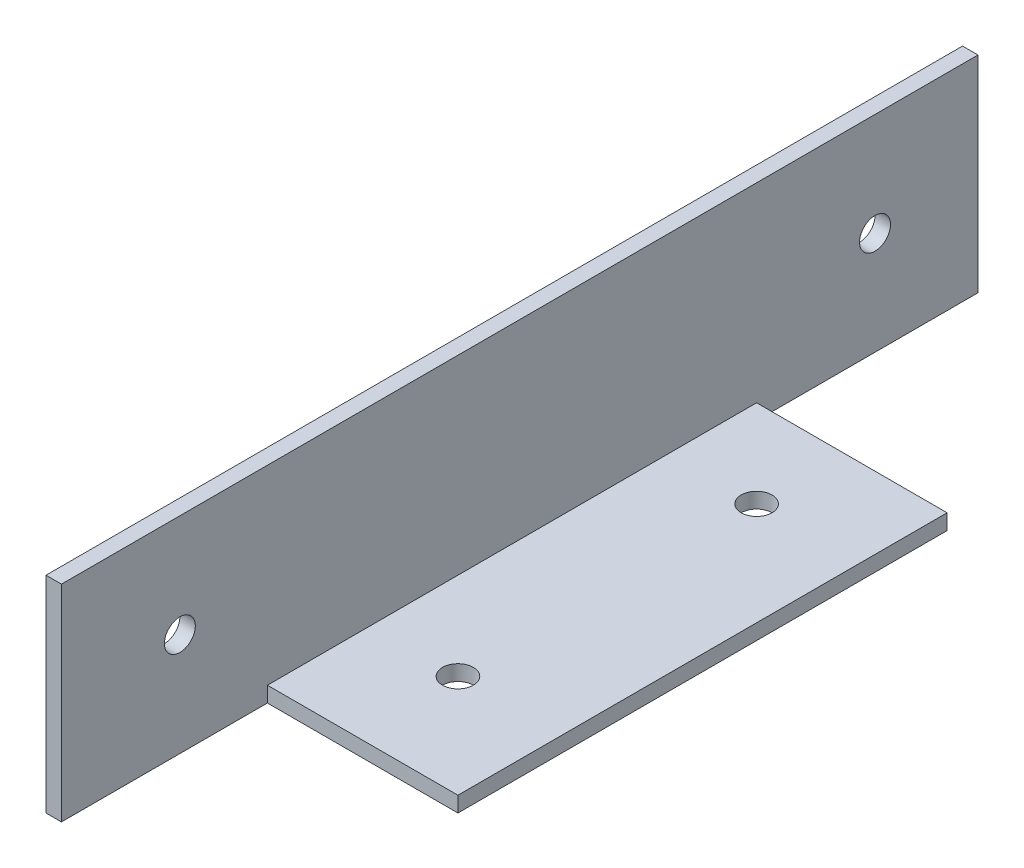
ISO-10303-21;
HEADER;
FILE_DESCRIPTION(('STEP AP214'),'2;1');
FILE_NAME('part.step','',(''),(''),'','','');
FILE_SCHEMA(('AUTOMOTIVE_DESIGN { 1 0 10303 214 1 1 1 1 }'));
ENDSEC;
DATA;
#1=APPLICATION_CONTEXT('core data for automotive mechanical design processes');
#2=APPLICATION_PROTOCOL_DEFINITION('international standard','automotive_design',2000,#1);
#3=PRODUCT_CONTEXT('',#1,'mechanical');
#4=PRODUCT('Part','Part','',(#3));
#5=PRODUCT_RELATED_PRODUCT_CATEGORY('part','',(#4));
#6=PRODUCT_DEFINITION_FORMATION('','',#4);
#7=PRODUCT_DEFINITION_CONTEXT('part definition',#1,'design');
#8=PRODUCT_DEFINITION('design','',#6,#7);
#9=PRODUCT_DEFINITION_SHAPE('','',#8);
#10=(LENGTH_UNIT() NAMED_UNIT(*) SI_UNIT(.MILLI.,.METRE.));
#11=(NAMED_UNIT(*) PLANE_ANGLE_UNIT() SI_UNIT($,.RADIAN.));
#12=(NAMED_UNIT(*) SI_UNIT($,.STERADIAN.) SOLID_ANGLE_UNIT());
#13=UNCERTAINTY_MEASURE_WITH_UNIT(LENGTH_MEASURE(1.E-05),#10,'distance_accuracy_value','');
#14=(GEOMETRIC_REPRESENTATION_CONTEXT(3) GLOBAL_UNCERTAINTY_ASSIGNED_CONTEXT((#13)) GLOBAL_UNIT_ASSIGNED_CONTEXT((#10,
#11,#12)) REPRESENTATION_CONTEXT('',''));
#15=CARTESIAN_POINT('',(0.,0.,0.));
#16=DIRECTION('',(0.,0.,1.));
#17=DIRECTION('',(1.,0.,0.));
#18=AXIS2_PLACEMENT_3D('',#15,#16,#17);
#19=CARTESIAN_POINT('',(-23.4313705903621,6.59147368421053,89.));
#20=DIRECTION('',(0.,-1.,0.));
#21=DIRECTION('',(0.,0.,-1.));
#22=AXIS2_PLACEMENT_3D('',#19,#20,#21);
#23=PLANE('',#22);
#24=DIRECTION('',(-1.,0.,0.));
#25=VECTOR('',#24,1.);
#26=CARTESIAN_POINT('',(-23.4313705903621,6.59147368421053,0.));
#27=LINE('',#26,#25);
#28=CARTESIAN_POINT('',(-23.4313705903621,6.59147368421053,0.));
#29=VERTEX_POINT('',#28);
#30=CARTESIAN_POINT('',(-24.9313705903621,6.59147368421053,0.));
#31=VERTEX_POINT('',#30);
#32=EDGE_CURVE('E146',#29,#31,#27,.T.);
#33=ORIENTED_EDGE('',*,*,#32,.T.);
#34=DIRECTION('',(0.,0.,-1.));
#35=VECTOR('',#34,1.);
#36=CARTESIAN_POINT('',(-24.9313705903621,6.59147368421053,89.));
#37=LINE('',#36,#35);
#38=CARTESIAN_POINT('',(-24.9313705903621,6.59147368421053,89.));
#39=VERTEX_POINT('',#38);
#40=EDGE_CURVE('E11',#39,#31,#37,.T.);
#41=ORIENTED_EDGE('',*,*,#40,.F.);
#42=DIRECTION('',(-1.,0.,0.));
#43=VECTOR('',#42,1.);
#44=CARTESIAN_POINT('',(-23.4313705903621,6.59147368421053,89.));
#45=LINE('',#44,#43);
#46=CARTESIAN_POINT('',(-23.4313705903621,6.59147368421053,89.));
#47=VERTEX_POINT('',#46);
#48=EDGE_CURVE('E145',#47,#39,#45,.T.);
#49=ORIENTED_EDGE('',*,*,#48,.F.);
#50=DIRECTION('',(0.,0.,-1.));
#51=VECTOR('',#50,1.);
#52=CARTESIAN_POINT('',(-23.4313705903621,6.59147368421053,89.));
#53=LINE('',#52,#51);
#54=EDGE_CURVE('E126',#47,#29,#53,.T.);
#55=ORIENTED_EDGE('',*,*,#54,.T.);
#56=EDGE_LOOP('',(#33,#41,#49,#55));
#57=FACE_BOUND('',#56,.T.);
#58=ADVANCED_FACE('F31',(#57),#23,.F.);
#59=CARTESIAN_POINT('',(-24.9313705903621,6.59147368421053,89.));
#60=DIRECTION('',(1.,0.,0.));
#61=DIRECTION('',(0.,0.,-1.));
#62=AXIS2_PLACEMENT_3D('',#59,#60,#61);
#63=PLANE('',#62);
#64=CARTESIAN_POINT('',(-24.9313705903621,-3.40852631578947,9.99999999999999));
#65=DIRECTION('',(1.,0.,0.));
#66=DIRECTION('',(0.,0.,-1.));
#67=AXIS2_PLACEMENT_3D('',#64,#65,#66);
#68=CIRCLE('',#67,1.5);
#69=CARTESIAN_POINT('',(-24.9313705903621,-3.40852631578947,8.5));
#70=VERTEX_POINT('',#69);
#71=EDGE_CURVE('E186',#70,#70,#68,.T.);
#72=ORIENTED_EDGE('',*,*,#71,.T.);
#73=EDGE_LOOP('',(#72));
#74=FACE_BOUND('',#73,.T.);
#75=CARTESIAN_POINT('',(-24.9313705903621,-3.40852631578947,77.5));
#76=DIRECTION('',(1.,0.,0.));
#77=DIRECTION('',(0.,0.,-1.));
#78=AXIS2_PLACEMENT_3D('',#75,#76,#77);
#79=CIRCLE('',#78,1.5);
#80=CARTESIAN_POINT('',(-24.9313705903621,-3.40852631578947,76.));
#81=VERTEX_POINT('',#80);
#82=EDGE_CURVE('E120',#81,#81,#79,.T.);
#83=ORIENTED_EDGE('',*,*,#82,.T.);
#84=EDGE_LOOP('',(#83));
#85=FACE_BOUND('',#84,.T.);
#86=DIRECTION('',(0.,-1.,0.));
#87=VECTOR('',#86,1.);
#88=CARTESIAN_POINT('',(-24.9313705903621,6.59147368421053,0.));
#89=LINE('',#88,#87);
#90=CARTESIAN_POINT('',(-24.9313705903621,-13.4085263157895,0.));
#91=VERTEX_POINT('',#90);
#92=EDGE_CURVE('E143',#31,#91,#89,.T.);
#93=ORIENTED_EDGE('',*,*,#92,.T.);
#94=DIRECTION('',(0.,0.,-1.));
#95=VECTOR('',#94,1.);
#96=CARTESIAN_POINT('',(-24.9313705903621,-13.4085263157895,89.));
#97=LINE('',#96,#95);
#98=CARTESIAN_POINT('',(-24.9313705903621,-13.4085263157895,89.));
#99=VERTEX_POINT('',#98);
#100=EDGE_CURVE('E38',#99,#91,#97,.T.);
#101=ORIENTED_EDGE('',*,*,#100,.F.);
#102=DIRECTION('',(0.,-1.,0.));
#103=VECTOR('',#102,1.);
#104=CARTESIAN_POINT('',(-24.9313705903621,6.59147368421053,89.));
#105=LINE('',#104,#103);
#106=EDGE_CURVE('E73',#39,#99,#105,.T.);
#107=ORIENTED_EDGE('',*,*,#106,.F.);
#108=ORIENTED_EDGE('',*,*,#40,.T.);
#109=EDGE_LOOP('',(#93,#101,#107,#108));
#110=FACE_BOUND('',#109,.T.);
#111=ADVANCED_FACE('F208',(#74,#85,#110),#63,.F.);
#112=CARTESIAN_POINT('',(-24.9313705903621,-13.4085263157895,89.));
#113=DIRECTION('',(0.,1.,0.));
#114=DIRECTION('',(0.,0.,1.));
#115=AXIS2_PLACEMENT_3D('',#112,#113,#114);
#116=PLANE('',#115);
#117=CARTESIAN_POINT('',(-14.9313705903621,-13.4085263157895,30.));
#118=DIRECTION('',(0.,1.,0.));
#119=DIRECTION('',(0.,0.,1.));
#120=AXIS2_PLACEMENT_3D('',#117,#118,#119);
#121=CIRCLE('',#120,1.5);
#122=CARTESIAN_POINT('',(-14.9313705903621,-13.4085263157895,31.5));
#123=VERTEX_POINT('',#122);
#124=EDGE_CURVE('E161',#123,#123,#121,.T.);
#125=ORIENTED_EDGE('',*,*,#124,.T.);
#126=EDGE_LOOP('',(#125));
#127=FACE_BOUND('',#126,.T.);
#128=CARTESIAN_POINT('',(-14.9313705903621,-13.4085263157895,59.));
#129=DIRECTION('',(0.,1.,0.));
#130=DIRECTION('',(0.,0.,1.));
#131=AXIS2_PLACEMENT_3D('',#128,#129,#130);
#132=CIRCLE('',#131,1.5);
#133=CARTESIAN_POINT('',(-14.9313705903621,-13.4085263157895,60.5));
#134=VERTEX_POINT('',#133);
#135=EDGE_CURVE('E151',#134,#134,#132,.T.);
#136=ORIENTED_EDGE('',*,*,#135,.T.);
#137=EDGE_LOOP('',(#136));
#138=FACE_BOUND('',#137,.T.);
#139=DIRECTION('',(0.,0.,1.));
#140=VECTOR('',#139,1.);
#141=CARTESIAN_POINT('',(-23.4313705903621,-13.4085263157895,89.));
#142=LINE('',#141,#140);
#143=CARTESIAN_POINT('',(-23.4313705903621,-13.4085263157895,0.));
#144=VERTEX_POINT('',#143);
#145=CARTESIAN_POINT('',(-23.4313705903621,-13.4085263157895,21.5));
#146=VERTEX_POINT('',#145);
#147=EDGE_CURVE('E178',#144,#146,#142,.T.);
#148=ORIENTED_EDGE('',*,*,#147,.T.);
#149=DIRECTION('',(1.,0.,0.));
#150=VECTOR('',#149,1.);
#151=CARTESIAN_POINT('',(-24.9313705903621,-13.4085263157895,21.5));
#152=LINE('',#151,#150);
#153=CARTESIAN_POINT('',(-4.93137059036207,-13.4085263157895,21.5));
#154=VERTEX_POINT('',#153);
#155=EDGE_CURVE('E107',#146,#154,#152,.T.);
#156=ORIENTED_EDGE('',*,*,#155,.T.);
#157=DIRECTION('',(0.,0.,-1.));
#158=VECTOR('',#157,1.);
#159=CARTESIAN_POINT('',(-4.93137059036207,-13.4085263157895,89.));
#160=LINE('',#159,#158);
#161=CARTESIAN_POINT('',(-4.93137059036207,-13.4085263157895,69.));
#162=VERTEX_POINT('',#161);
#163=EDGE_CURVE('E128',#162,#154,#160,.T.);
#164=ORIENTED_EDGE('',*,*,#163,.F.);
#165=DIRECTION('',(-1.,0.,0.));
#166=VECTOR('',#165,1.);
#167=CARTESIAN_POINT('',(-24.9313705903621,-13.4085263157895,69.));
#168=LINE('',#167,#166);
#169=CARTESIAN_POINT('',(-23.4313705903621,-13.4085263157895,69.));
#170=VERTEX_POINT('',#169);
#171=EDGE_CURVE('E167',#162,#170,#168,.T.);
#172=ORIENTED_EDGE('',*,*,#171,.T.);
#173=DIRECTION('',(0.,0.,1.));
#174=VECTOR('',#173,1.);
#175=CARTESIAN_POINT('',(-23.4313705903621,-13.4085263157895,89.));
#176=LINE('',#175,#174);
#177=CARTESIAN_POINT('',(-23.4313705903621,-13.4085263157895,89.));
#178=VERTEX_POINT('',#177);
#179=EDGE_CURVE('E170',#170,#178,#176,.T.);
#180=ORIENTED_EDGE('',*,*,#179,.T.);
#181=DIRECTION('',(1.,0.,0.));
#182=VECTOR('',#181,1.);
#183=CARTESIAN_POINT('',(-24.9313705903621,-13.4085263157895,89.));
#184=LINE('',#183,#182);
#185=EDGE_CURVE('E141',#99,#178,#184,.T.);
#186=ORIENTED_EDGE('',*,*,#185,.F.);
#187=ORIENTED_EDGE('',*,*,#100,.T.);
#188=DIRECTION('',(1.,0.,0.));
#189=VECTOR('',#188,1.);
#190=CARTESIAN_POINT('',(-24.9313705903621,-13.4085263157895,0.));
#191=LINE('',#190,#189);
#192=EDGE_CURVE('E139',#91,#144,#191,.T.);
#193=ORIENTED_EDGE('',*,*,#192,.T.);
#194=EDGE_LOOP('',(#148,#156,#164,#172,#180,#186,#187,#193));
#195=FACE_BOUND('',#194,.T.);
#196=ADVANCED_FACE('F138',(#127,#138,#195),#116,.F.);
#197=CARTESIAN_POINT('',(-4.93137059036207,-13.4085263157895,89.));
#198=DIRECTION('',(-1.,0.,0.));
#199=DIRECTION('',(0.,0.,1.));
#200=AXIS2_PLACEMENT_3D('',#197,#198,#199);
#201=PLANE('',#200);
#202=ORIENTED_EDGE('',*,*,#163,.T.);
#203=DIRECTION('',(0.,1.,0.));
#204=VECTOR('',#203,1.);
#205=CARTESIAN_POINT('',(-4.93137059036204,-111.908526315789,21.5));
#206=LINE('',#205,#204);
#207=CARTESIAN_POINT('',(-4.93137059036207,-11.9085263157895,21.5));
#208=VERTEX_POINT('',#207);
#209=EDGE_CURVE('E110',#154,#208,#206,.T.);
#210=ORIENTED_EDGE('',*,*,#209,.T.);
#211=DIRECTION('',(0.,0.,-1.));
#212=VECTOR('',#211,1.);
#213=CARTESIAN_POINT('',(-4.93137059036207,-11.9085263157895,89.));
#214=LINE('',#213,#212);
#215=CARTESIAN_POINT('',(-4.93137059036207,-11.9085263157895,69.));
#216=VERTEX_POINT('',#215);
#217=EDGE_CURVE('E119',#216,#208,#214,.T.);
#218=ORIENTED_EDGE('',*,*,#217,.F.);
#219=DIRECTION('',(0.,1.,0.));
#220=VECTOR('',#219,1.);
#221=CARTESIAN_POINT('',(-4.93137059036204,-111.908526315789,69.));
#222=LINE('',#221,#220);
#223=EDGE_CURVE('E172',#162,#216,#222,.T.);
#224=ORIENTED_EDGE('',*,*,#223,.F.);
#225=EDGE_LOOP('',(#202,#210,#218,#224));
#226=FACE_BOUND('',#225,.T.);
#227=ADVANCED_FACE('F238',(#226),#201,.F.);
#228=CARTESIAN_POINT('',(-4.93137059036207,-11.9085263157895,89.));
#229=DIRECTION('',(0.,-1.,0.));
#230=DIRECTION('',(1.,0.,0.));
#231=AXIS2_PLACEMENT_3D('',#228,#229,#230);
#232=PLANE('',#231);
#233=CARTESIAN_POINT('',(-14.9313705903621,-11.9085263157895,30.));
#234=DIRECTION('',(0.,1.,0.));
#235=DIRECTION('',(-1.,0.,0.));
#236=AXIS2_PLACEMENT_3D('',#233,#234,#235);
#237=CIRCLE('',#236,1.5);
#238=CARTESIAN_POINT('',(-16.4313705903621,-11.9085263157895,30.));
#239=VERTEX_POINT('',#238);
#240=EDGE_CURVE('E164',#239,#239,#237,.T.);
#241=ORIENTED_EDGE('',*,*,#240,.F.);
#242=EDGE_LOOP('',(#241));
#243=FACE_BOUND('',#242,.T.);
#244=CARTESIAN_POINT('',(-14.9313705903621,-11.9085263157895,59.));
#245=DIRECTION('',(0.,1.,0.));
#246=DIRECTION('',(-1.,0.,0.));
#247=AXIS2_PLACEMENT_3D('',#244,#245,#246);
#248=CIRCLE('',#247,1.5);
#249=CARTESIAN_POINT('',(-16.4313705903621,-11.9085263157895,59.));
#250=VERTEX_POINT('',#249);
#251=EDGE_CURVE('E158',#250,#250,#248,.T.);
#252=ORIENTED_EDGE('',*,*,#251,.F.);
#253=EDGE_LOOP('',(#252));
#254=FACE_BOUND('',#253,.T.);
#255=ORIENTED_EDGE('',*,*,#217,.T.);
#256=DIRECTION('',(1.,0.,0.));
#257=VECTOR('',#256,1.);
#258=CARTESIAN_POINT('',(-4.93137059036207,-11.9085263157895,21.5));
#259=LINE('',#258,#257);
#260=CARTESIAN_POINT('',(-23.4313705903621,-11.9085263157895,21.5));
#261=VERTEX_POINT('',#260);
#262=EDGE_CURVE('E104',#261,#208,#259,.T.);
#263=ORIENTED_EDGE('',*,*,#262,.F.);
#264=DIRECTION('',(0.,0.,-1.));
#265=VECTOR('',#264,1.);
#266=CARTESIAN_POINT('',(-23.4313705903621,-11.9085263157895,89.));
#267=LINE('',#266,#265);
#268=CARTESIAN_POINT('',(-23.4313705903621,-11.9085263157895,69.));
#269=VERTEX_POINT('',#268);
#270=EDGE_CURVE('E117',#269,#261,#267,.T.);
#271=ORIENTED_EDGE('',*,*,#270,.F.);
#272=DIRECTION('',(-1.,0.,0.));
#273=VECTOR('',#272,1.);
#274=CARTESIAN_POINT('',(-4.93137059036207,-11.9085263157895,69.));
#275=LINE('',#274,#273);
#276=EDGE_CURVE('E174',#216,#269,#275,.T.);
#277=ORIENTED_EDGE('',*,*,#276,.F.);
#278=EDGE_LOOP('',(#255,#263,#271,#277));
#279=FACE_BOUND('',#278,.T.);
#280=ADVANCED_FACE('F115',(#243,#254,#279),#232,.F.);
#281=CARTESIAN_POINT('',(-23.4313705903621,-11.9085263157895,89.));
#282=DIRECTION('',(-1.,0.,0.));
#283=DIRECTION('',(0.,0.,1.));
#284=AXIS2_PLACEMENT_3D('',#281,#282,#283);
#285=PLANE('',#284);
#286=CARTESIAN_POINT('',(-23.4313705903621,-3.40852631578947,9.99999999999999));
#287=DIRECTION('',(1.,0.,0.));
#288=DIRECTION('',(0.,0.,-1.));
#289=AXIS2_PLACEMENT_3D('',#286,#287,#288);
#290=CIRCLE('',#289,1.5);
#291=CARTESIAN_POINT('',(-23.4313705903621,-3.40852631578947,8.5));
#292=VERTEX_POINT('',#291);
#293=EDGE_CURVE('E189',#292,#292,#290,.T.);
#294=ORIENTED_EDGE('',*,*,#293,.F.);
#295=EDGE_LOOP('',(#294));
#296=FACE_BOUND('',#295,.T.);
#297=CARTESIAN_POINT('',(-23.4313705903621,-3.40852631578947,77.5));
#298=DIRECTION('',(1.,0.,0.));
#299=DIRECTION('',(0.,0.,-1.));
#300=AXIS2_PLACEMENT_3D('',#297,#298,#299);
#301=CIRCLE('',#300,1.5);
#302=CARTESIAN_POINT('',(-23.4313705903621,-3.40852631578947,76.));
#303=VERTEX_POINT('',#302);
#304=EDGE_CURVE('E183',#303,#303,#301,.T.);
#305=ORIENTED_EDGE('',*,*,#304,.F.);
#306=EDGE_LOOP('',(#305));
#307=FACE_BOUND('',#306,.T.);
#308=DIRECTION('',(0.,1.,0.));
#309=VECTOR('',#308,1.);
#310=CARTESIAN_POINT('',(-23.4313705903621,-11.9085263157895,0.));
#311=LINE('',#310,#309);
#312=EDGE_CURVE('E45',#144,#29,#311,.T.);
#313=ORIENTED_EDGE('',*,*,#312,.T.);
#314=ORIENTED_EDGE('',*,*,#54,.F.);
#315=DIRECTION('',(0.,1.,0.));
#316=VECTOR('',#315,1.);
#317=CARTESIAN_POINT('',(-23.4313705903621,-11.9085263157895,89.));
#318=LINE('',#317,#316);
#319=EDGE_CURVE('E54',#178,#47,#318,.T.);
#320=ORIENTED_EDGE('',*,*,#319,.F.);
#321=ORIENTED_EDGE('',*,*,#179,.F.);
#322=DIRECTION('',(0.,1.,0.));
#323=VECTOR('',#322,1.);
#324=CARTESIAN_POINT('',(-23.431370590362,-111.908526315789,69.));
#325=LINE('',#324,#323);
#326=EDGE_CURVE('E124',#170,#269,#325,.T.);
#327=ORIENTED_EDGE('',*,*,#326,.T.);
#328=ORIENTED_EDGE('',*,*,#270,.T.);
#329=DIRECTION('',(0.,1.,0.));
#330=VECTOR('',#329,1.);
#331=CARTESIAN_POINT('',(-23.431370590362,-111.908526315789,21.5));
#332=LINE('',#331,#330);
#333=EDGE_CURVE('E101',#146,#261,#332,.T.);
#334=ORIENTED_EDGE('',*,*,#333,.F.);
#335=ORIENTED_EDGE('',*,*,#147,.F.);
#336=EDGE_LOOP('',(#313,#314,#320,#321,#327,#328,#334,#335));
#337=FACE_BOUND('',#336,.T.);
#338=ADVANCED_FACE('F122',(#296,#307,#337),#285,.F.);
#339=CARTESIAN_POINT('',(-24.9313705903621,6.59147368421053,89.));
#340=DIRECTION('',(0.,0.,1.));
#341=DIRECTION('',(1.,0.,0.));
#342=AXIS2_PLACEMENT_3D('',#339,#340,#341);
#343=PLANE('',#342);
#344=ORIENTED_EDGE('',*,*,#185,.T.);
#345=ORIENTED_EDGE('',*,*,#319,.T.);
#346=ORIENTED_EDGE('',*,*,#48,.T.);
#347=ORIENTED_EDGE('',*,*,#106,.T.);
#348=EDGE_LOOP('',(#344,#345,#346,#347));
#349=FACE_BOUND('',#348,.T.);
#350=ADVANCED_FACE('F198',(#349),#343,.T.);
#351=CARTESIAN_POINT('',(-24.9313705903621,6.59147368421053,0.));
#352=DIRECTION('',(0.,0.,1.));
#353=DIRECTION('',(1.,0.,0.));
#354=AXIS2_PLACEMENT_3D('',#351,#352,#353);
#355=PLANE('',#354);
#356=ORIENTED_EDGE('',*,*,#312,.F.);
#357=ORIENTED_EDGE('',*,*,#192,.F.);
#358=ORIENTED_EDGE('',*,*,#92,.F.);
#359=ORIENTED_EDGE('',*,*,#32,.F.);
#360=EDGE_LOOP('',(#356,#357,#358,#359));
#361=FACE_BOUND('',#360,.T.);
#362=ADVANCED_FACE('F142',(#361),#355,.F.);
#363=CARTESIAN_POINT('',(-14.931370590362,-111.908526315789,59.));
#364=DIRECTION('',(0.,1.,0.));
#365=DIRECTION('',(-1.,0.,0.));
#366=AXIS2_PLACEMENT_3D('',#363,#364,#365);
#367=CYLINDRICAL_SURFACE('',#366,1.5);
#368=ORIENTED_EDGE('',*,*,#251,.T.);
#369=EDGE_LOOP('',(#368));
#370=FACE_BOUND('',#369,.T.);
#371=ORIENTED_EDGE('',*,*,#135,.F.);
#372=EDGE_LOOP('',(#371));
#373=FACE_BOUND('',#372,.T.);
#374=ADVANCED_FACE('F220',(#370,#373),#367,.F.);
#375=CARTESIAN_POINT('',(-14.931370590362,-111.908526315789,30.));
#376=DIRECTION('',(0.,1.,0.));
#377=DIRECTION('',(-1.,0.,0.));
#378=AXIS2_PLACEMENT_3D('',#375,#376,#377);
#379=CYLINDRICAL_SURFACE('',#378,1.5);
#380=ORIENTED_EDGE('',*,*,#240,.T.);
#381=EDGE_LOOP('',(#380));
#382=FACE_BOUND('',#381,.T.);
#383=ORIENTED_EDGE('',*,*,#124,.F.);
#384=EDGE_LOOP('',(#383));
#385=FACE_BOUND('',#384,.T.);
#386=ADVANCED_FACE('F284',(#382,#385),#379,.F.);
#387=CARTESIAN_POINT('',(-4.93137059036204,-111.908526315789,69.));
#388=DIRECTION('',(0.,0.,-1.));
#389=DIRECTION('',(-1.,0.,0.));
#390=AXIS2_PLACEMENT_3D('',#387,#388,#389);
#391=PLANE('',#390);
#392=ORIENTED_EDGE('',*,*,#223,.T.);
#393=ORIENTED_EDGE('',*,*,#276,.T.);
#394=ORIENTED_EDGE('',*,*,#326,.F.);
#395=ORIENTED_EDGE('',*,*,#171,.F.);
#396=EDGE_LOOP('',(#392,#393,#394,#395));
#397=FACE_BOUND('',#396,.T.);
#398=ADVANCED_FACE('F281',(#397),#391,.F.);
#399=CARTESIAN_POINT('',(-4.93137059036204,-111.908526315789,21.5));
#400=DIRECTION('',(0.,0.,1.));
#401=DIRECTION('',(1.,0.,0.));
#402=AXIS2_PLACEMENT_3D('',#399,#400,#401);
#403=PLANE('',#402);
#404=ORIENTED_EDGE('',*,*,#333,.T.);
#405=ORIENTED_EDGE('',*,*,#262,.T.);
#406=ORIENTED_EDGE('',*,*,#209,.F.);
#407=ORIENTED_EDGE('',*,*,#155,.F.);
#408=EDGE_LOOP('',(#404,#405,#406,#407));
#409=FACE_BOUND('',#408,.T.);
#410=ADVANCED_FACE('F103',(#409),#403,.F.);
#411=CARTESIAN_POINT('',(-123.431370590362,-3.40852631578947,77.5));
#412=DIRECTION('',(1.,0.,0.));
#413=DIRECTION('',(0.,0.,-1.));
#414=AXIS2_PLACEMENT_3D('',#411,#412,#413);
#415=CYLINDRICAL_SURFACE('',#414,1.5);
#416=ORIENTED_EDGE('',*,*,#304,.T.);
#417=EDGE_LOOP('',(#416));
#418=FACE_BOUND('',#417,.T.);
#419=ORIENTED_EDGE('',*,*,#82,.F.);
#420=EDGE_LOOP('',(#419));
#421=FACE_BOUND('',#420,.T.);
#422=ADVANCED_FACE('F202',(#418,#421),#415,.F.);
#423=CARTESIAN_POINT('',(-123.431370590362,-3.40852631578947,9.99999999999999));
#424=DIRECTION('',(1.,0.,0.));
#425=DIRECTION('',(0.,0.,-1.));
#426=AXIS2_PLACEMENT_3D('',#423,#424,#425);
#427=CYLINDRICAL_SURFACE('',#426,1.5);
#428=ORIENTED_EDGE('',*,*,#293,.T.);
#429=EDGE_LOOP('',(#428));
#430=FACE_BOUND('',#429,.T.);
#431=ORIENTED_EDGE('',*,*,#71,.F.);
#432=EDGE_LOOP('',(#431));
#433=FACE_BOUND('',#432,.T.);
#434=ADVANCED_FACE('F193',(#430,#433),#427,.F.);
#435=CLOSED_SHELL('',(#58,#111,#196,#227,#280,#338,#350,#362,#374,#386,#398,#410,#422,#434));
#436=MANIFOLD_SOLID_BREP('B2',#435);
#437=ADVANCED_BREP_SHAPE_REPRESENTATION('',(#18,#436),#14);
#438=SHAPE_DEFINITION_REPRESENTATION(#9,#437);
ENDSEC;
END-ISO-10303-21;
